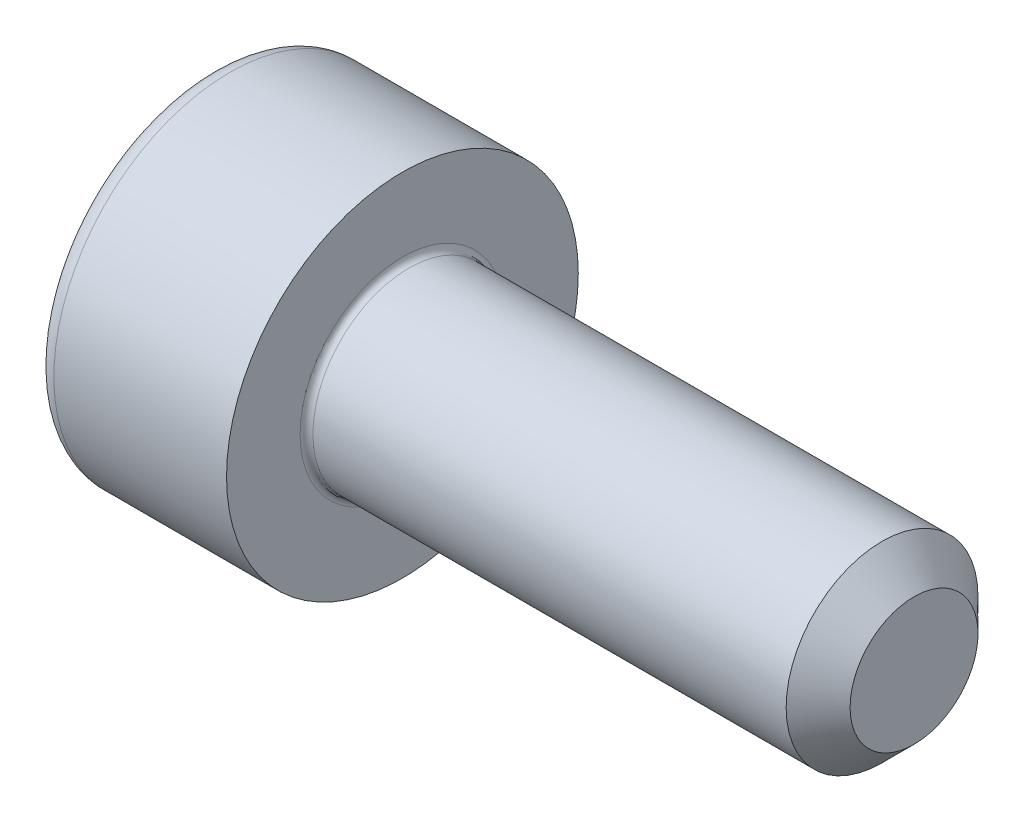
ISO-10303-21;
HEADER;
FILE_DESCRIPTION(('STEP AP214'),'2;1');
FILE_NAME('part.step','',(''),(''),'','','');
FILE_SCHEMA(('AUTOMOTIVE_DESIGN { 1 0 10303 214 1 1 1 1 }'));
ENDSEC;
DATA;
#1=APPLICATION_CONTEXT('core data for automotive mechanical design processes');
#2=APPLICATION_PROTOCOL_DEFINITION('international standard','automotive_design',2000,#1);
#3=PRODUCT_CONTEXT('',#1,'mechanical');
#4=PRODUCT('Part','Part','',(#3));
#5=PRODUCT_RELATED_PRODUCT_CATEGORY('part','',(#4));
#6=PRODUCT_DEFINITION_FORMATION('','',#4);
#7=PRODUCT_DEFINITION_CONTEXT('part definition',#1,'design');
#8=PRODUCT_DEFINITION('design','',#6,#7);
#9=PRODUCT_DEFINITION_SHAPE('','',#8);
#10=(LENGTH_UNIT() NAMED_UNIT(*) SI_UNIT(.MILLI.,.METRE.));
#11=(NAMED_UNIT(*) PLANE_ANGLE_UNIT() SI_UNIT($,.RADIAN.));
#12=(NAMED_UNIT(*) SI_UNIT($,.STERADIAN.) SOLID_ANGLE_UNIT());
#13=UNCERTAINTY_MEASURE_WITH_UNIT(LENGTH_MEASURE(1.E-05),#10,'distance_accuracy_value','');
#14=(GEOMETRIC_REPRESENTATION_CONTEXT(3) GLOBAL_UNCERTAINTY_ASSIGNED_CONTEXT((#13)) GLOBAL_UNIT_ASSIGNED_CONTEXT((#10,
#11,#12)) REPRESENTATION_CONTEXT('',''));
#15=CARTESIAN_POINT('',(0.,0.,0.));
#16=DIRECTION('',(0.,0.,1.));
#17=DIRECTION('',(1.,0.,0.));
#18=AXIS2_PLACEMENT_3D('',#15,#16,#17);
#19=CARTESIAN_POINT('',(-1.70499999995855,0.,0.));
#20=DIRECTION('',(-1.,0.,0.));
#21=DIRECTION('',(0.,0.,1.));
#22=AXIS2_PLACEMENT_3D('',#19,#20,#21);
#23=CONICAL_SURFACE('',#22,1.45203592694543,1.04719755116673);
#24=CARTESIAN_POINT('',(-0.866666666638594,0.,5.6843418860808E-11));
#25=VERTEX_POINT('',#24);
#26=VERTEX_LOOP('',#25);
#27=FACE_BOUND('',#26,.T.);
#28=CARTESIAN_POINT('',(-1.69999999999683,0.721687836486614,1.25000000000073));
#29=CARTESIAN_POINT('',(-1.68168471569959,0.753401646201208,1.19507007027348));
#30=CARTESIAN_POINT('',(-1.66502792318178,0.785389209070127,1.13966598617421));
#31=CARTESIAN_POINT('',(-1.63595399211708,0.84991817806204,1.02789853332018));
#32=CARTESIAN_POINT('',(-1.62354713770228,0.882460730366704,0.971533179320532));
#33=CARTESIAN_POINT('',(-1.6042349743309,0.947142551438496,0.859500978898109));
#34=CARTESIAN_POINT('',(-1.59720111723721,0.979271870866215,0.80385136523669));
#35=CARTESIAN_POINT('',(-1.58880573007026,1.04368160991192,0.69229042470728));
#36=CARTESIAN_POINT('',(-1.58743724622264,1.07596179557865,0.636379503054742));
#37=CARTESIAN_POINT('',(-1.59029143133602,1.13627385956167,0.531915943926812));
#38=CARTESIAN_POINT('',(-1.59381330324979,1.1643147881945,0.483347630843326));
#39=CARTESIAN_POINT('',(-1.6049733129394,1.22021396795688,0.386527411393458));
#40=CARTESIAN_POINT('',(-1.61261525922153,1.2480720258904,0.338275839652414));
#41=CARTESIAN_POINT('',(-1.63171864582891,1.3040863632348,0.241256161419605));
#42=CARTESIAN_POINT('',(-1.64326102637968,1.33223555685171,0.192500327883029));
#43=CARTESIAN_POINT('',(-1.66945735051954,1.38811422029201,0.095715643745389));
#44=CARTESIAN_POINT('',(-1.68410514296599,1.41584440543344,0.0476855541771357));
#45=CARTESIAN_POINT('',(-1.69999999999683,1.44337567297449,-7.28193582287218E-13));
#46=B_SPLINE_CURVE_WITH_KNOTS('',3,(#28,#29,#30,#31,#32,#33,#34,#35,#36,#37,#38,#39,#40,#41,#42,
#43,#44,#45),.UNSPECIFIED.,.F.,.F.,(4,2,2,2,2,2,2,2,4),(0.,0.198135007225364,0.39674613564669,
0.590442253851989,0.783900555569172,0.952317364151902,1.12089012112743,1.29320101406076,
1.46517373345157),.UNSPECIFIED.);
#47=CARTESIAN_POINT('',(-1.69999999999683,0.721687836487243,1.25000000000037));
#48=VERTEX_POINT('',#47);
#49=CARTESIAN_POINT('',(-1.69999999999671,1.44337567297428,-3.64386380621524E-13));
#50=VERTEX_POINT('',#49);
#51=EDGE_CURVE('E21',#48,#50,#46,.T.);
#52=ORIENTED_EDGE('',*,*,#51,.T.);
#53=CARTESIAN_POINT('',(-1.69999999999683,1.44337567297449,7.23888528641434E-13));
#54=CARTESIAN_POINT('',(-1.68168471569959,1.41166186325989,-0.0549299297265243));
#55=CARTESIAN_POINT('',(-1.66502792318179,1.37967430039098,-0.110334013825796));
#56=CARTESIAN_POINT('',(-1.63595399211708,1.31514533139906,-0.222101466679826));
#57=CARTESIAN_POINT('',(-1.62354713770228,1.2826027790944,-0.278466820679472));
#58=CARTESIAN_POINT('',(-1.6042349743309,1.21792095802261,-0.390499021101896));
#59=CARTESIAN_POINT('',(-1.59720111723721,1.18579163859489,-0.446148634763315));
#60=CARTESIAN_POINT('',(-1.58880573007026,1.12138189954918,-0.557709575292725));
#61=CARTESIAN_POINT('',(-1.58743724622264,1.08910171388245,-0.613620496945263));
#62=CARTESIAN_POINT('',(-1.59029143133603,1.02878964989943,-0.718084056073192));
#63=CARTESIAN_POINT('',(-1.5938133032498,1.0007487212666,-0.766652369156678));
#64=CARTESIAN_POINT('',(-1.6049733129394,0.944849541504218,-0.863472588606545));
#65=CARTESIAN_POINT('',(-1.61261525922153,0.916991483570705,-0.911724160347588));
#66=CARTESIAN_POINT('',(-1.63171864582891,0.860977146226302,-1.0087438385804));
#67=CARTESIAN_POINT('',(-1.64326102637968,0.832827952609396,-1.05749967211697));
#68=CARTESIAN_POINT('',(-1.66945735051954,0.776949289169097,-1.15428435625461));
#69=CARTESIAN_POINT('',(-1.68410514296599,0.749219104027664,-1.20231444582286));
#70=CARTESIAN_POINT('',(-1.69999999999683,0.721687836486618,-1.25000000000073));
#71=B_SPLINE_CURVE_WITH_KNOTS('',3,(#53,#54,#55,#56,#57,#58,#59,#60,#61,#62,#63,#64,#65,#66,#67,
#68,#69,#70),.UNSPECIFIED.,.F.,.F.,(4,2,2,2,2,2,2,2,4),(0.,0.198135007225364,0.396746135646691,
0.59044225385199,0.783900555569174,0.952317364151902,1.12089012112743,1.29320101406076,
1.46517373345156),.UNSPECIFIED.);
#72=CARTESIAN_POINT('',(-1.69999999999683,0.721687836487247,-1.25000000000036));
#73=VERTEX_POINT('',#72);
#74=EDGE_CURVE('E83',#50,#73,#71,.T.);
#75=ORIENTED_EDGE('',*,*,#74,.T.);
#76=CARTESIAN_POINT('',(-1.69999999999683,0.721687836487875,-1.25));
#77=CARTESIAN_POINT('',(-1.68168471569959,0.658260217058687,-1.25));
#78=CARTESIAN_POINT('',(-1.66502792318178,0.594285091320849,-1.25));
#79=CARTESIAN_POINT('',(-1.63595399211708,0.465227153337023,-1.25));
#80=CARTESIAN_POINT('',(-1.62354713770228,0.400142048727695,-1.25));
#81=CARTESIAN_POINT('',(-1.6042349743309,0.27077840658411,-1.25));
#82=CARTESIAN_POINT('',(-1.59720111723721,0.206519767728672,-1.25));
#83=CARTESIAN_POINT('',(-1.58880573007026,0.0777002896372671,-1.25));
#84=CARTESIAN_POINT('',(-1.58743724622264,0.0131399183038013,-1.25));
#85=CARTESIAN_POINT('',(-1.59029143133602,-0.107484209662232,-1.25));
#86=CARTESIAN_POINT('',(-1.59381330324979,-0.163566066927906,-1.25));
#87=CARTESIAN_POINT('',(-1.6049733129394,-0.275364426452666,-1.25));
#88=CARTESIAN_POINT('',(-1.61261525922153,-0.331080542319694,-1.25));
#89=CARTESIAN_POINT('',(-1.63171864582891,-0.443109217008502,-1.25));
#90=CARTESIAN_POINT('',(-1.64326102637968,-0.499407604242315,-1.25));
#91=CARTESIAN_POINT('',(-1.66945735051954,-0.611164931122914,-1.25));
#92=CARTESIAN_POINT('',(-1.68410514296599,-0.66662530140578,-1.25));
#93=CARTESIAN_POINT('',(-1.69999999999683,-0.721687836487873,-1.25));
#94=B_SPLINE_CURVE_WITH_KNOTS('',3,(#76,#77,#78,#79,#80,#81,#82,#83,#84,#85,#86,#87,#88,#89,#90,
#91,#92,#93),.UNSPECIFIED.,.F.,.F.,(4,2,2,2,2,2,2,2,4),(0.,0.198135007225364,0.39674613564669,
0.590442253851989,0.783900555569172,0.952317364151903,1.12089012112743,1.29320101406077,
1.46517373345157),.UNSPECIFIED.);
#95=CARTESIAN_POINT('',(-1.69999999999683,-0.721687836487244,-1.25000000000036));
#96=VERTEX_POINT('',#95);
#97=EDGE_CURVE('E108',#73,#96,#94,.T.);
#98=ORIENTED_EDGE('',*,*,#97,.T.);
#99=CARTESIAN_POINT('',(-1.69999999999683,-0.721687836486615,-1.25000000000073));
#100=CARTESIAN_POINT('',(-1.68168471569959,-0.753401646201209,-1.19507007027348));
#101=CARTESIAN_POINT('',(-1.66502792318178,-0.785389209070128,-1.13966598617421));
#102=CARTESIAN_POINT('',(-1.63595399211708,-0.849918178062041,-1.02789853332018));
#103=CARTESIAN_POINT('',(-1.62354713770228,-0.882460730366705,-0.97153317932053));
#104=CARTESIAN_POINT('',(-1.6042349743309,-0.947142551438497,-0.859500978898107));
#105=CARTESIAN_POINT('',(-1.59720111723721,-0.979271870866216,-0.803851365236688));
#106=CARTESIAN_POINT('',(-1.58880573007026,-1.04368160991192,-0.692290424707278));
#107=CARTESIAN_POINT('',(-1.58743724622264,-1.07596179557865,-0.63637950305474));
#108=CARTESIAN_POINT('',(-1.59029143133602,-1.13627385956167,-0.531915943926811));
#109=CARTESIAN_POINT('',(-1.59381330324979,-1.1643147881945,-0.483347630843325));
#110=CARTESIAN_POINT('',(-1.6049733129394,-1.22021396795688,-0.386527411393458));
#111=CARTESIAN_POINT('',(-1.61261525922153,-1.2480720258904,-0.338275839652415));
#112=CARTESIAN_POINT('',(-1.63171864582891,-1.3040863632348,-0.241256161419606));
#113=CARTESIAN_POINT('',(-1.64326102637968,-1.33223555685171,-0.192500327883031));
#114=CARTESIAN_POINT('',(-1.66945735051954,-1.388114220292,-0.0957156437453916));
#115=CARTESIAN_POINT('',(-1.68410514296599,-1.41584440543344,-0.0476855541771388));
#116=CARTESIAN_POINT('',(-1.69999999999683,-1.44337567297448,7.24622076330796E-13));
#117=B_SPLINE_CURVE_WITH_KNOTS('',3,(#99,#100,#101,#102,#103,#104,#105,#106,#107,#108,#109,#110,
#111,#112,#113,#114,#115,#116),.UNSPECIFIED.,.F.,.F.,(4,2,2,2,2,2,2,2,4),(0.,0.198135007225364,
0.396746135646689,0.590442253851988,0.783900555569171,0.9523173641519,1.12089012112743,
1.29320101406076,1.46517373345156),.UNSPECIFIED.);
#118=CARTESIAN_POINT('',(-1.69999999999682,-1.44337567297448,0.));
#119=VERTEX_POINT('',#118);
#120=EDGE_CURVE('E133',#96,#119,#117,.T.);
#121=ORIENTED_EDGE('',*,*,#120,.T.);
#122=CARTESIAN_POINT('',(-1.69999999999682,-1.44337567297448,-7.28234982655757E-13));
#123=CARTESIAN_POINT('',(-1.68168471569959,-1.41166186325989,0.0549299297265198));
#124=CARTESIAN_POINT('',(-1.66502792318178,-1.37967430039097,0.110334013825791));
#125=CARTESIAN_POINT('',(-1.63595399211708,-1.31514533139905,0.222101466679821));
#126=CARTESIAN_POINT('',(-1.62354713770227,-1.28260277909439,0.278466820679466));
#127=CARTESIAN_POINT('',(-1.6042349743309,-1.2179209580226,0.390499021101889));
#128=CARTESIAN_POINT('',(-1.59720111723721,-1.18579163859488,0.446148634763308));
#129=CARTESIAN_POINT('',(-1.58880573007025,-1.12138189954918,0.557709575292717));
#130=CARTESIAN_POINT('',(-1.58743724622264,-1.08910171388244,0.613620496945255));
#131=CARTESIAN_POINT('',(-1.59029143133602,-1.02878964989943,0.718084056073184));
#132=CARTESIAN_POINT('',(-1.59381330324979,-1.00074872126659,0.76665236915667));
#133=CARTESIAN_POINT('',(-1.60497331293939,-0.944849541504211,0.863472588606539));
#134=CARTESIAN_POINT('',(-1.61261525922153,-0.916991483570697,0.911724160347582));
#135=CARTESIAN_POINT('',(-1.63171864582891,-0.860977146226293,1.00874383858039));
#136=CARTESIAN_POINT('',(-1.64326102637968,-0.832827952609387,1.05749967211697));
#137=CARTESIAN_POINT('',(-1.66945735051953,-0.776949289169087,1.15428435625461));
#138=CARTESIAN_POINT('',(-1.68410514296599,-0.749219104027654,1.20231444582286));
#139=CARTESIAN_POINT('',(-1.69999999999682,-0.721687836486608,1.25000000000072));
#140=B_SPLINE_CURVE_WITH_KNOTS('',3,(#122,#123,#124,#125,#126,#127,#128,#129,#130,#131,#132,
#133,#134,#135,#136,#137,#138,#139),.UNSPECIFIED.,.F.,.F.,(4,2,2,2,2,2,2,2,4),(0.,
0.198135007225363,0.396746135646689,0.590442253851987,0.783900555569169,0.9523173641519,
1.12089012112743,1.29320101406076,1.46517373345156),.UNSPECIFIED.);
#141=CARTESIAN_POINT('',(-1.69999999999682,-0.721687836487238,1.25000000000036));
#142=VERTEX_POINT('',#141);
#143=EDGE_CURVE('E142',#119,#142,#140,.T.);
#144=ORIENTED_EDGE('',*,*,#143,.T.);
#145=CARTESIAN_POINT('',(-1.69999999999682,-0.721687836487868,1.25));
#146=CARTESIAN_POINT('',(-1.68289610804108,-0.662444421356254,1.25));
#147=CARTESIAN_POINT('',(-1.66723701244222,-0.602732338217057,1.25));
#148=CARTESIAN_POINT('',(-1.63956150394095,-0.482338190495706,1.25));
#149=CARTESIAN_POINT('',(-1.62755324131853,-0.421654269432413,1.25));
#150=CARTESIAN_POINT('',(-1.60824250125111,-0.300967355190456,1.25));
#151=CARTESIAN_POINT('',(-1.60083706702381,-0.240981353766474,1.25));
#152=CARTESIAN_POINT('',(-1.59089571081102,-0.120663270100029,1.25));
#153=CARTESIAN_POINT('',(-1.58835450314258,-0.0603316350500145,1.25));
#154=CARTESIAN_POINT('',(-1.58835450314258,0.0603316350500146,1.25));
#155=CARTESIAN_POINT('',(-1.59089571081102,0.120663270100029,1.25));
#156=CARTESIAN_POINT('',(-1.60083706702381,0.240981353766475,1.25));
#157=CARTESIAN_POINT('',(-1.60824250125111,0.300967355190458,1.25));
#158=CARTESIAN_POINT('',(-1.62755324131853,0.421654269432415,1.25));
#159=CARTESIAN_POINT('',(-1.63956150394095,0.482338190495709,1.25));
#160=CARTESIAN_POINT('',(-1.66723701244222,0.60273233821706,1.25));
#161=CARTESIAN_POINT('',(-1.68289610804109,0.662444421356258,1.25));
#162=CARTESIAN_POINT('',(-1.69999999999683,0.721687836487872,1.25));
#163=B_SPLINE_CURVE_WITH_KNOTS('',3,(#145,#146,#147,#148,#149,#150,#151,#152,#153,#154,#155,
#156,#157,#158,#159,#160,#161,#162),.UNSPECIFIED.,.F.,.F.,(4,2,2,2,2,2,2,2,4),(0.,
0.185045872449119,0.370501866306718,0.551644286983009,0.732589758330081,0.913535229677154,
1.09467765035345,1.28013364421105,1.46517951666017),.UNSPECIFIED.);
#164=EDGE_CURVE('E73',#142,#48,#163,.T.);
#165=ORIENTED_EDGE('',*,*,#164,.T.);
#166=EDGE_LOOP('',(#52,#75,#98,#121,#144,#165));
#167=FACE_BOUND('',#166,.T.);
#168=ADVANCED_FACE('F17',(#27,#167),#23,.F.);
#169=CARTESIAN_POINT('',(0.133333333289239,0.721687836487034,1.25));
#170=DIRECTION('',(0.,0.866025403784439,0.5));
#171=DIRECTION('',(0.,-0.5,0.866025403784439));
#172=AXIS2_PLACEMENT_3D('',#169,#170,#171);
#173=PLANE('',#172);
#174=DIRECTION('',(1.,0.,0.));
#175=VECTOR('',#174,1.);
#176=CARTESIAN_POINT('',(0.133333333289239,0.721687836487034,1.25));
#177=LINE('',#176,#175);
#178=CARTESIAN_POINT('',(-3.,0.721687836487034,1.25));
#179=VERTEX_POINT('',#178);
#180=EDGE_CURVE('E86',#48,#179,#177,.F.);
#181=ORIENTED_EDGE('',*,*,#180,.T.);
#182=DIRECTION('',(0.,-0.500000000000002,0.866025403784438));
#183=VECTOR('',#182,1.);
#184=CARTESIAN_POINT('',(-3.,1.44337567297407,0.));
#185=LINE('',#184,#183);
#186=CARTESIAN_POINT('',(-3.,1.44337567297407,0.));
#187=VERTEX_POINT('',#186);
#188=EDGE_CURVE('E91',#187,#179,#185,.T.);
#189=ORIENTED_EDGE('',*,*,#188,.F.);
#190=DIRECTION('',(1.,0.,0.));
#191=VECTOR('',#190,1.);
#192=CARTESIAN_POINT('',(0.133333333289239,1.44337567297407,0.));
#193=LINE('',#192,#191);
#194=EDGE_CURVE('E89',#187,#50,#193,.T.);
#195=ORIENTED_EDGE('',*,*,#194,.T.);
#196=ORIENTED_EDGE('',*,*,#51,.F.);
#197=EDGE_LOOP('',(#181,#189,#195,#196));
#198=FACE_BOUND('',#197,.T.);
#199=ADVANCED_FACE('F78',(#198),#173,.F.);
#200=CARTESIAN_POINT('',(0.133333333289239,-0.721687836487031,1.25));
#201=DIRECTION('',(0.,0.,1.));
#202=DIRECTION('',(0.,-1.,0.));
#203=AXIS2_PLACEMENT_3D('',#200,#201,#202);
#204=PLANE('',#203);
#205=DIRECTION('',(1.,0.,0.));
#206=VECTOR('',#205,1.);
#207=CARTESIAN_POINT('',(0.133333333289239,-0.721687836487028,1.25));
#208=LINE('',#207,#206);
#209=CARTESIAN_POINT('',(-3.,-0.721687836487029,1.25));
#210=VERTEX_POINT('',#209);
#211=EDGE_CURVE('E147',#142,#210,#208,.F.);
#212=ORIENTED_EDGE('',*,*,#211,.T.);
#213=DIRECTION('',(0.,1.,0.));
#214=VECTOR('',#213,1.);
#215=CARTESIAN_POINT('',(-3.,0.,1.25));
#216=LINE('',#215,#214);
#217=EDGE_CURVE('E97',#179,#210,#216,.F.);
#218=ORIENTED_EDGE('',*,*,#217,.F.);
#219=ORIENTED_EDGE('',*,*,#180,.F.);
#220=ORIENTED_EDGE('',*,*,#164,.F.);
#221=EDGE_LOOP('',(#212,#218,#219,#220));
#222=FACE_BOUND('',#221,.T.);
#223=ADVANCED_FACE('F152',(#222),#204,.F.);
#224=CARTESIAN_POINT('',(0.133333333289239,-1.44337567297406,0.));
#225=DIRECTION('',(0.,-0.866025403784438,0.500000000000001));
#226=DIRECTION('',(0.,-0.500000000000001,-0.866025403784438));
#227=AXIS2_PLACEMENT_3D('',#224,#225,#226);
#228=PLANE('',#227);
#229=DIRECTION('',(1.,0.,0.));
#230=VECTOR('',#229,1.);
#231=CARTESIAN_POINT('',(0.133333333289239,-1.44337567297406,0.));
#232=LINE('',#231,#230);
#233=CARTESIAN_POINT('',(-3.,-1.44337567297406,0.));
#234=VERTEX_POINT('',#233);
#235=EDGE_CURVE('E141',#119,#234,#232,.F.);
#236=ORIENTED_EDGE('',*,*,#235,.T.);
#237=DIRECTION('',(0.,-0.499999999999999,-0.866025403784439));
#238=VECTOR('',#237,1.);
#239=CARTESIAN_POINT('',(-3.,-0.721687836487031,1.25));
#240=LINE('',#239,#238);
#241=EDGE_CURVE('E270',#210,#234,#240,.T.);
#242=ORIENTED_EDGE('',*,*,#241,.F.);
#243=ORIENTED_EDGE('',*,*,#211,.F.);
#244=ORIENTED_EDGE('',*,*,#143,.F.);
#245=EDGE_LOOP('',(#236,#242,#243,#244));
#246=FACE_BOUND('',#245,.T.);
#247=ADVANCED_FACE('F129',(#246),#228,.F.);
#248=CARTESIAN_POINT('',(0.133333333289239,-0.721687836487034,-1.25));
#249=DIRECTION('',(0.,-0.866025403784439,-0.499999999999999));
#250=DIRECTION('',(0.,0.499999999999999,-0.866025403784439));
#251=AXIS2_PLACEMENT_3D('',#248,#249,#250);
#252=PLANE('',#251);
#253=DIRECTION('',(1.,0.,0.));
#254=VECTOR('',#253,1.);
#255=CARTESIAN_POINT('',(0.133333333289239,-0.721687836487034,-1.25));
#256=LINE('',#255,#254);
#257=CARTESIAN_POINT('',(-3.,-0.721687836487034,-1.25));
#258=VERTEX_POINT('',#257);
#259=EDGE_CURVE('E140',#96,#258,#256,.F.);
#260=ORIENTED_EDGE('',*,*,#259,.T.);
#261=DIRECTION('',(0.,0.499999999999997,-0.86602540378444));
#262=VECTOR('',#261,1.);
#263=CARTESIAN_POINT('',(-3.,-1.44337567297406,0.));
#264=LINE('',#263,#262);
#265=EDGE_CURVE('E265',#234,#258,#264,.T.);
#266=ORIENTED_EDGE('',*,*,#265,.F.);
#267=ORIENTED_EDGE('',*,*,#235,.F.);
#268=ORIENTED_EDGE('',*,*,#120,.F.);
#269=EDGE_LOOP('',(#260,#266,#267,#268));
#270=FACE_BOUND('',#269,.T.);
#271=ADVANCED_FACE('F125',(#270),#252,.F.);
#272=CARTESIAN_POINT('',(0.133333333289239,0.721687836487036,-1.25));
#273=DIRECTION('',(0.,0.,-1.));
#274=DIRECTION('',(0.,1.,0.));
#275=AXIS2_PLACEMENT_3D('',#272,#273,#274);
#276=PLANE('',#275);
#277=DIRECTION('',(1.,0.,0.));
#278=VECTOR('',#277,1.);
#279=CARTESIAN_POINT('',(0.133333333289239,0.721687836487037,-1.25));
#280=LINE('',#279,#278);
#281=CARTESIAN_POINT('',(-3.,0.721687836487037,-1.25));
#282=VERTEX_POINT('',#281);
#283=EDGE_CURVE('E40',#73,#282,#280,.F.);
#284=ORIENTED_EDGE('',*,*,#283,.T.);
#285=DIRECTION('',(0.,1.,0.));
#286=VECTOR('',#285,1.);
#287=CARTESIAN_POINT('',(-3.,0.,-1.25));
#288=LINE('',#287,#286);
#289=EDGE_CURVE('E260',#258,#282,#288,.T.);
#290=ORIENTED_EDGE('',*,*,#289,.F.);
#291=ORIENTED_EDGE('',*,*,#259,.F.);
#292=ORIENTED_EDGE('',*,*,#97,.F.);
#293=EDGE_LOOP('',(#284,#290,#291,#292));
#294=FACE_BOUND('',#293,.T.);
#295=ADVANCED_FACE('F119',(#294),#276,.F.);
#296=CARTESIAN_POINT('',(0.133333333289239,1.44337567297407,0.));
#297=DIRECTION('',(0.,0.866025403784438,-0.5));
#298=DIRECTION('',(0.,0.5,0.866025403784438));
#299=AXIS2_PLACEMENT_3D('',#296,#297,#298);
#300=PLANE('',#299);
#301=ORIENTED_EDGE('',*,*,#194,.F.);
#302=DIRECTION('',(0.,0.500000000000001,0.866025403784438));
#303=VECTOR('',#302,1.);
#304=CARTESIAN_POINT('',(-3.,0.721687836487036,-1.25));
#305=LINE('',#304,#303);
#306=EDGE_CURVE('E258',#282,#187,#305,.T.);
#307=ORIENTED_EDGE('',*,*,#306,.F.);
#308=ORIENTED_EDGE('',*,*,#283,.F.);
#309=ORIENTED_EDGE('',*,*,#74,.F.);
#310=EDGE_LOOP('',(#301,#307,#308,#309));
#311=FACE_BOUND('',#310,.T.);
#312=ADVANCED_FACE('F95',(#311),#300,.F.);
#313=CARTESIAN_POINT('',(-3.,0.,0.));
#314=DIRECTION('',(-1.,0.,0.));
#315=DIRECTION('',(0.,0.,1.));
#316=AXIS2_PLACEMENT_3D('',#313,#314,#315);
#317=PLANE('',#316);
#318=ORIENTED_EDGE('',*,*,#289,.T.);
#319=ORIENTED_EDGE('',*,*,#306,.T.);
#320=ORIENTED_EDGE('',*,*,#188,.T.);
#321=ORIENTED_EDGE('',*,*,#217,.T.);
#322=ORIENTED_EDGE('',*,*,#241,.T.);
#323=ORIENTED_EDGE('',*,*,#265,.T.);
#324=EDGE_LOOP('',(#318,#319,#320,#321,#322,#323));
#325=FACE_BOUND('',#324,.T.);
#326=CARTESIAN_POINT('',(-3.,0.,0.));
#327=DIRECTION('',(1.,0.,0.));
#328=DIRECTION('',(0.,1.,0.));
#329=AXIS2_PLACEMENT_3D('',#326,#327,#328);
#330=CIRCLE('',#329,2.45);
#331=CARTESIAN_POINT('',(-3.,2.45,0.));
#332=VERTEX_POINT('',#331);
#333=EDGE_CURVE('E222',#332,#332,#330,.T.);
#334=ORIENTED_EDGE('',*,*,#333,.F.);
#335=EDGE_LOOP('',(#334));
#336=FACE_BOUND('',#335,.T.);
#337=ADVANCED_FACE('F118',(#325,#336),#317,.T.);
#338=CARTESIAN_POINT('',(-2.7,0.,0.));
#339=DIRECTION('',(1.,0.,0.));
#340=DIRECTION('',(0.,1.,0.));
#341=AXIS2_PLACEMENT_3D('',#338,#339,#340);
#342=TOROIDAL_SURFACE('',#341,2.45,0.3);
#343=ORIENTED_EDGE('',*,*,#333,.T.);
#344=EDGE_LOOP('',(#343));
#345=FACE_BOUND('',#344,.T.);
#346=CARTESIAN_POINT('',(-2.7,0.,0.));
#347=DIRECTION('',(1.,0.,0.));
#348=DIRECTION('',(0.,0.,-1.));
#349=AXIS2_PLACEMENT_3D('',#346,#347,#348);
#350=CIRCLE('',#349,2.75);
#351=CARTESIAN_POINT('',(-2.7,0.,-2.75));
#352=VERTEX_POINT('',#351);
#353=EDGE_CURVE('E287',#352,#352,#350,.T.);
#354=ORIENTED_EDGE('',*,*,#353,.F.);
#355=EDGE_LOOP('',(#354));
#356=FACE_BOUND('',#355,.T.);
#357=ADVANCED_FACE('F206',(#345,#356),#342,.T.);
#358=CARTESIAN_POINT('',(-3.,0.,0.));
#359=DIRECTION('',(1.,0.,0.));
#360=DIRECTION('',(0.,0.,-1.));
#361=AXIS2_PLACEMENT_3D('',#358,#359,#360);
#362=CYLINDRICAL_SURFACE('',#361,2.75);
#363=ORIENTED_EDGE('',*,*,#353,.T.);
#364=EDGE_LOOP('',(#363));
#365=FACE_BOUND('',#364,.T.);
#366=CARTESIAN_POINT('',(0.,0.,0.));
#367=DIRECTION('',(1.,0.,0.));
#368=DIRECTION('',(0.,0.,-1.));
#369=AXIS2_PLACEMENT_3D('',#366,#367,#368);
#370=CIRCLE('',#369,2.75);
#371=CARTESIAN_POINT('',(0.,0.,-2.75));
#372=VERTEX_POINT('',#371);
#373=EDGE_CURVE('E284',#372,#372,#370,.T.);
#374=ORIENTED_EDGE('',*,*,#373,.F.);
#375=EDGE_LOOP('',(#374));
#376=FACE_BOUND('',#375,.T.);
#377=ADVANCED_FACE('F203',(#365,#376),#362,.T.);
#378=CARTESIAN_POINT('',(8.,0.,0.));
#379=DIRECTION('',(1.,0.,0.));
#380=DIRECTION('',(0.,0.,-1.));
#381=AXIS2_PLACEMENT_3D('',#378,#379,#380);
#382=PLANE('',#381);
#383=CARTESIAN_POINT('',(8.0000000000382,0.,0.));
#384=DIRECTION('',(-1.,0.,0.));
#385=DIRECTION('',(0.,0.,1.));
#386=AXIS2_PLACEMENT_3D('',#383,#384,#385);
#387=CIRCLE('',#386,1.0000000000332);
#388=CARTESIAN_POINT('',(8.0000000000382,0.,1.0000000000332));
#389=VERTEX_POINT('',#388);
#390=EDGE_CURVE('E281',#389,#389,#387,.T.);
#391=ORIENTED_EDGE('',*,*,#390,.F.);
#392=EDGE_LOOP('',(#391));
#393=FACE_BOUND('',#392,.T.);
#394=ADVANCED_FACE('F200',(#393),#382,.T.);
#395=CARTESIAN_POINT('',(0.,0.,0.));
#396=DIRECTION('',(1.,0.,0.));
#397=DIRECTION('',(0.,0.,-1.));
#398=AXIS2_PLACEMENT_3D('',#395,#396,#397);
#399=PLANE('',#398);
#400=CARTESIAN_POINT('',(0.,0.,0.));
#401=DIRECTION('',(1.,0.,0.));
#402=DIRECTION('',(0.,0.,1.));
#403=AXIS2_PLACEMENT_3D('',#400,#401,#402);
#404=CIRCLE('',#403,1.6);
#405=CARTESIAN_POINT('',(0.,0.,1.6));
#406=VERTEX_POINT('',#405);
#407=EDGE_CURVE('E187',#406,#406,#404,.F.);
#408=ORIENTED_EDGE('',*,*,#407,.T.);
#409=EDGE_LOOP('',(#408));
#410=FACE_BOUND('',#409,.T.);
#411=ORIENTED_EDGE('',*,*,#373,.T.);
#412=EDGE_LOOP('',(#411));
#413=FACE_BOUND('',#412,.T.);
#414=ADVANCED_FACE('F191',(#410,#413),#399,.T.);
#415=CARTESIAN_POINT('',(7.50000000010687,0.,0.));
#416=DIRECTION('',(-1.,0.,0.));
#417=DIRECTION('',(0.,0.,1.));
#418=AXIS2_PLACEMENT_3D('',#415,#416,#417);
#419=CONICAL_SURFACE('',#418,1.49999999990769,0.785398163340605);
#420=CARTESIAN_POINT('',(7.5,0.,0.));
#421=DIRECTION('',(1.,0.,0.));
#422=DIRECTION('',(0.,0.,-1.));
#423=AXIS2_PLACEMENT_3D('',#420,#421,#422);
#424=CIRCLE('',#423,1.5);
#425=CARTESIAN_POINT('',(7.5,0.,-1.5));
#426=VERTEX_POINT('',#425);
#427=EDGE_CURVE('E31',#426,#426,#424,.F.);
#428=ORIENTED_EDGE('',*,*,#427,.F.);
#429=EDGE_LOOP('',(#428));
#430=FACE_BOUND('',#429,.T.);
#431=ORIENTED_EDGE('',*,*,#390,.T.);
#432=EDGE_LOOP('',(#431));
#433=FACE_BOUND('',#432,.T.);
#434=ADVANCED_FACE('F169',(#430,#433),#419,.T.);
#435=CARTESIAN_POINT('',(0.1,0.,0.));
#436=DIRECTION('',(1.,0.,0.));
#437=DIRECTION('',(0.,0.,1.));
#438=AXIS2_PLACEMENT_3D('',#435,#436,#437);
#439=TOROIDAL_SURFACE('',#438,1.6,0.1);
#440=ORIENTED_EDGE('',*,*,#407,.F.);
#441=EDGE_LOOP('',(#440));
#442=FACE_BOUND('',#441,.T.);
#443=CARTESIAN_POINT('',(0.1,0.,0.));
#444=DIRECTION('',(1.,0.,0.));
#445=DIRECTION('',(0.,0.,-1.));
#446=AXIS2_PLACEMENT_3D('',#443,#444,#445);
#447=CIRCLE('',#446,1.5);
#448=CARTESIAN_POINT('',(0.1,0.,-1.5));
#449=VERTEX_POINT('',#448);
#450=EDGE_CURVE('E11',#449,#449,#447,.T.);
#451=ORIENTED_EDGE('',*,*,#450,.F.);
#452=EDGE_LOOP('',(#451));
#453=FACE_BOUND('',#452,.T.);
#454=ADVANCED_FACE('F163',(#442,#453),#439,.F.);
#455=CARTESIAN_POINT('',(0.,0.,0.));
#456=DIRECTION('',(1.,0.,0.));
#457=DIRECTION('',(0.,0.,-1.));
#458=AXIS2_PLACEMENT_3D('',#455,#456,#457);
#459=CYLINDRICAL_SURFACE('',#458,1.5);
#460=ORIENTED_EDGE('',*,*,#450,.T.);
#461=EDGE_LOOP('',(#460));
#462=FACE_BOUND('',#461,.T.);
#463=ORIENTED_EDGE('',*,*,#427,.T.);
#464=EDGE_LOOP('',(#463));
#465=FACE_BOUND('',#464,.T.);
#466=ADVANCED_FACE('F161',(#462,#465),#459,.T.);
#467=CLOSED_SHELL('',(#168,#199,#223,#247,#271,#295,#312,#337,#357,#377,#394,#414,#434,#454,#466));
#468=MANIFOLD_SOLID_BREP('B1',#467);
#469=ADVANCED_BREP_SHAPE_REPRESENTATION('',(#18,#468),#14);
#470=SHAPE_DEFINITION_REPRESENTATION(#9,#469);
ENDSEC;
END-ISO-10303-21;
